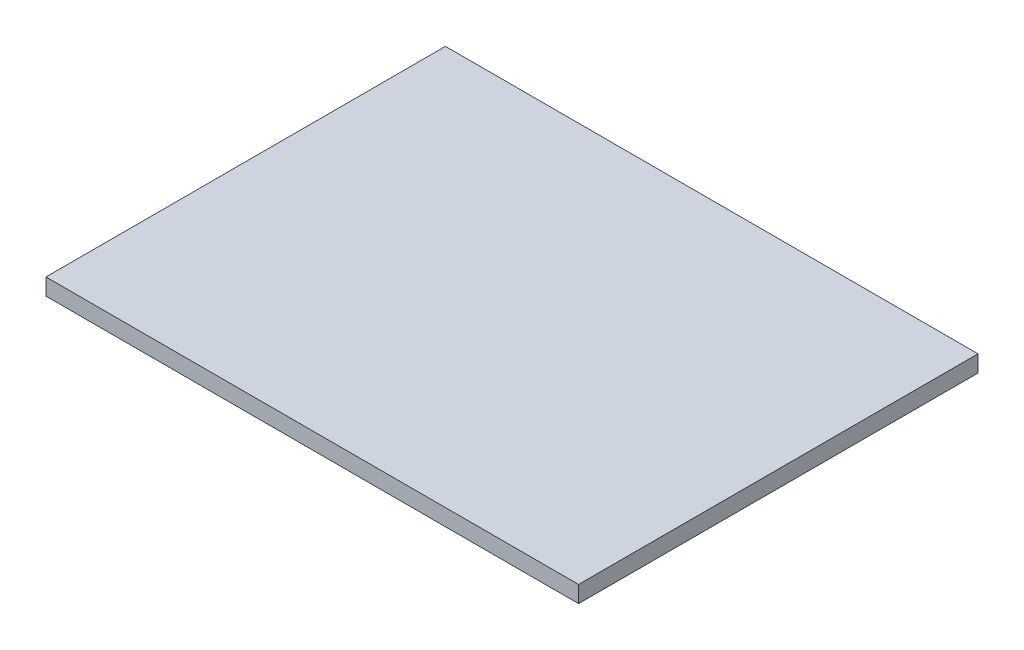
ISO-10303-21;
HEADER;
FILE_DESCRIPTION(('STEP AP214'),'2;1');
FILE_NAME('part.step','',(''),(''),'','','');
FILE_SCHEMA(('AUTOMOTIVE_DESIGN { 1 0 10303 214 1 1 1 1 }'));
ENDSEC;
DATA;
#1=APPLICATION_CONTEXT('core data for automotive mechanical design processes');
#2=APPLICATION_PROTOCOL_DEFINITION('international standard','automotive_design',2000,#1);
#3=PRODUCT_CONTEXT('',#1,'mechanical');
#4=PRODUCT('Part','Part','',(#3));
#5=PRODUCT_RELATED_PRODUCT_CATEGORY('part','',(#4));
#6=PRODUCT_DEFINITION_FORMATION('','',#4);
#7=PRODUCT_DEFINITION_CONTEXT('part definition',#1,'design');
#8=PRODUCT_DEFINITION('design','',#6,#7);
#9=PRODUCT_DEFINITION_SHAPE('','',#8);
#10=(LENGTH_UNIT() NAMED_UNIT(*) SI_UNIT(.MILLI.,.METRE.));
#11=(NAMED_UNIT(*) PLANE_ANGLE_UNIT() SI_UNIT($,.RADIAN.));
#12=(NAMED_UNIT(*) SI_UNIT($,.STERADIAN.) SOLID_ANGLE_UNIT());
#13=UNCERTAINTY_MEASURE_WITH_UNIT(LENGTH_MEASURE(1.E-05),#10,'distance_accuracy_value','');
#14=(GEOMETRIC_REPRESENTATION_CONTEXT(3) GLOBAL_UNCERTAINTY_ASSIGNED_CONTEXT((#13)) GLOBAL_UNIT_ASSIGNED_CONTEXT((#10,
#11,#12)) REPRESENTATION_CONTEXT('',''));
#15=CARTESIAN_POINT('',(0.,0.,0.));
#16=DIRECTION('',(0.,0.,1.));
#17=DIRECTION('',(1.,0.,0.));
#18=AXIS2_PLACEMENT_3D('',#15,#16,#17);
#19=CARTESIAN_POINT('',(101.6,6.35,76.2));
#20=DIRECTION('',(-1.,0.,0.));
#21=DIRECTION('',(0.,0.,1.));
#22=AXIS2_PLACEMENT_3D('',#19,#20,#21);
#23=PLANE('',#22);
#24=DIRECTION('',(0.,0.,-1.));
#25=VECTOR('',#24,1.);
#26=CARTESIAN_POINT('',(101.6,0.,76.2));
#27=LINE('',#26,#25);
#28=CARTESIAN_POINT('',(101.6,0.,76.2));
#29=VERTEX_POINT('',#28);
#30=CARTESIAN_POINT('',(101.6,0.,-76.2));
#31=VERTEX_POINT('',#30);
#32=EDGE_CURVE('E99',#29,#31,#27,.T.);
#33=ORIENTED_EDGE('',*,*,#32,.T.);
#34=DIRECTION('',(0.,-1.,0.));
#35=VECTOR('',#34,1.);
#36=CARTESIAN_POINT('',(101.6,6.35,-76.2));
#37=LINE('',#36,#35);
#38=CARTESIAN_POINT('',(101.6,6.35,-76.2));
#39=VERTEX_POINT('',#38);
#40=EDGE_CURVE('E11',#39,#31,#37,.T.);
#41=ORIENTED_EDGE('',*,*,#40,.F.);
#42=DIRECTION('',(0.,0.,-1.));
#43=VECTOR('',#42,1.);
#44=CARTESIAN_POINT('',(101.6,6.35,76.2));
#45=LINE('',#44,#43);
#46=CARTESIAN_POINT('',(101.6,6.35,76.2));
#47=VERTEX_POINT('',#46);
#48=EDGE_CURVE('E87',#47,#39,#45,.T.);
#49=ORIENTED_EDGE('',*,*,#48,.F.);
#50=DIRECTION('',(0.,-1.,0.));
#51=VECTOR('',#50,1.);
#52=CARTESIAN_POINT('',(101.6,6.35,76.2));
#53=LINE('',#52,#51);
#54=EDGE_CURVE('E95',#47,#29,#53,.T.);
#55=ORIENTED_EDGE('',*,*,#54,.T.);
#56=EDGE_LOOP('',(#33,#41,#49,#55));
#57=FACE_BOUND('',#56,.T.);
#58=ADVANCED_FACE('F36',(#57),#23,.F.);
#59=CARTESIAN_POINT('',(-101.6,6.35,-76.2));
#60=DIRECTION('',(0.,0.,1.));
#61=DIRECTION('',(1.,0.,0.));
#62=AXIS2_PLACEMENT_3D('',#59,#60,#61);
#63=PLANE('',#62);
#64=DIRECTION('',(-1.,0.,0.));
#65=VECTOR('',#64,1.);
#66=CARTESIAN_POINT('',(-101.6,0.,-76.2));
#67=LINE('',#66,#65);
#68=CARTESIAN_POINT('',(-101.6,0.,-76.2));
#69=VERTEX_POINT('',#68);
#70=EDGE_CURVE('E91',#31,#69,#67,.T.);
#71=ORIENTED_EDGE('',*,*,#70,.T.);
#72=DIRECTION('',(0.,-1.,0.));
#73=VECTOR('',#72,1.);
#74=CARTESIAN_POINT('',(-101.6,6.35,-76.2));
#75=LINE('',#74,#73);
#76=CARTESIAN_POINT('',(-101.6,6.35,-76.2));
#77=VERTEX_POINT('',#76);
#78=EDGE_CURVE('E44',#77,#69,#75,.T.);
#79=ORIENTED_EDGE('',*,*,#78,.F.);
#80=DIRECTION('',(-1.,0.,0.));
#81=VECTOR('',#80,1.);
#82=CARTESIAN_POINT('',(-101.6,6.35,-76.2));
#83=LINE('',#82,#81);
#84=EDGE_CURVE('E82',#39,#77,#83,.T.);
#85=ORIENTED_EDGE('',*,*,#84,.F.);
#86=ORIENTED_EDGE('',*,*,#40,.T.);
#87=EDGE_LOOP('',(#71,#79,#85,#86));
#88=FACE_BOUND('',#87,.T.);
#89=ADVANCED_FACE('F90',(#88),#63,.F.);
#90=CARTESIAN_POINT('',(-101.6,6.35,76.2));
#91=DIRECTION('',(1.,0.,0.));
#92=DIRECTION('',(0.,0.,-1.));
#93=AXIS2_PLACEMENT_3D('',#90,#91,#92);
#94=PLANE('',#93);
#95=DIRECTION('',(0.,0.,1.));
#96=VECTOR('',#95,1.);
#97=CARTESIAN_POINT('',(-101.6,0.,76.2));
#98=LINE('',#97,#96);
#99=CARTESIAN_POINT('',(-101.6,0.,76.2));
#100=VERTEX_POINT('',#99);
#101=EDGE_CURVE('E69',#69,#100,#98,.T.);
#102=ORIENTED_EDGE('',*,*,#101,.T.);
#103=DIRECTION('',(0.,-1.,0.));
#104=VECTOR('',#103,1.);
#105=CARTESIAN_POINT('',(-101.6,6.35,76.2));
#106=LINE('',#105,#104);
#107=CARTESIAN_POINT('',(-101.6,6.35,76.2));
#108=VERTEX_POINT('',#107);
#109=EDGE_CURVE('E92',#108,#100,#106,.T.);
#110=ORIENTED_EDGE('',*,*,#109,.F.);
#111=DIRECTION('',(0.,0.,1.));
#112=VECTOR('',#111,1.);
#113=CARTESIAN_POINT('',(-101.6,6.35,76.2));
#114=LINE('',#113,#112);
#115=EDGE_CURVE('E85',#77,#108,#114,.T.);
#116=ORIENTED_EDGE('',*,*,#115,.F.);
#117=ORIENTED_EDGE('',*,*,#78,.T.);
#118=EDGE_LOOP('',(#102,#110,#116,#117));
#119=FACE_BOUND('',#118,.T.);
#120=ADVANCED_FACE('F93',(#119),#94,.F.);
#121=CARTESIAN_POINT('',(-101.6,6.35,76.2));
#122=DIRECTION('',(0.,0.,-1.));
#123=DIRECTION('',(-1.,0.,0.));
#124=AXIS2_PLACEMENT_3D('',#121,#122,#123);
#125=PLANE('',#124);
#126=DIRECTION('',(1.,0.,0.));
#127=VECTOR('',#126,1.);
#128=CARTESIAN_POINT('',(-101.6,0.,76.2));
#129=LINE('',#128,#127);
#130=EDGE_CURVE('E75',#100,#29,#129,.T.);
#131=ORIENTED_EDGE('',*,*,#130,.T.);
#132=ORIENTED_EDGE('',*,*,#54,.F.);
#133=DIRECTION('',(1.,0.,0.));
#134=VECTOR('',#133,1.);
#135=CARTESIAN_POINT('',(-101.6,6.35,76.2));
#136=LINE('',#135,#134);
#137=EDGE_CURVE('E52',#108,#47,#136,.T.);
#138=ORIENTED_EDGE('',*,*,#137,.F.);
#139=ORIENTED_EDGE('',*,*,#109,.T.);
#140=EDGE_LOOP('',(#131,#132,#138,#139));
#141=FACE_BOUND('',#140,.T.);
#142=ADVANCED_FACE('F106',(#141),#125,.F.);
#143=CARTESIAN_POINT('',(0.,6.35,0.));
#144=DIRECTION('',(0.,-1.,0.));
#145=DIRECTION('',(0.,0.,-1.));
#146=AXIS2_PLACEMENT_3D('',#143,#144,#145);
#147=PLANE('',#146);
#148=ORIENTED_EDGE('',*,*,#48,.T.);
#149=ORIENTED_EDGE('',*,*,#84,.T.);
#150=ORIENTED_EDGE('',*,*,#115,.T.);
#151=ORIENTED_EDGE('',*,*,#137,.T.);
#152=EDGE_LOOP('',(#148,#149,#150,#151));
#153=FACE_BOUND('',#152,.T.);
#154=ADVANCED_FACE('F83',(#153),#147,.F.);
#155=CARTESIAN_POINT('',(0.,0.,0.));
#156=DIRECTION('',(0.,-1.,0.));
#157=DIRECTION('',(0.,0.,-1.));
#158=AXIS2_PLACEMENT_3D('',#155,#156,#157);
#159=PLANE('',#158);
#160=ORIENTED_EDGE('',*,*,#32,.F.);
#161=ORIENTED_EDGE('',*,*,#130,.F.);
#162=ORIENTED_EDGE('',*,*,#101,.F.);
#163=ORIENTED_EDGE('',*,*,#70,.F.);
#164=EDGE_LOOP('',(#160,#161,#162,#163));
#165=FACE_BOUND('',#164,.T.);
#166=ADVANCED_FACE('F109',(#165),#159,.T.);
#167=CLOSED_SHELL('',(#58,#89,#120,#142,#154,#166));
#168=MANIFOLD_SOLID_BREP('B2',#167);
#169=ADVANCED_BREP_SHAPE_REPRESENTATION('',(#18,#168),#14);
#170=SHAPE_DEFINITION_REPRESENTATION(#9,#169);
ENDSEC;
END-ISO-10303-21;
